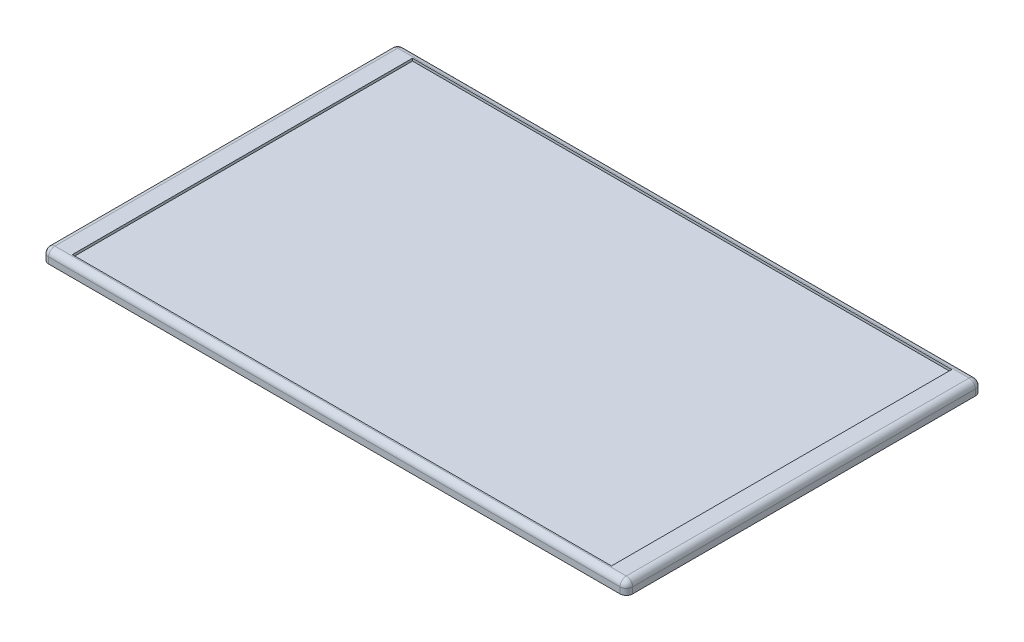
ISO-10303-21;
HEADER;
FILE_DESCRIPTION(('STEP AP214'),'2;1');
FILE_NAME('part.step','',(''),(''),'','','');
FILE_SCHEMA(('AUTOMOTIVE_DESIGN { 1 0 10303 214 1 1 1 1 }'));
ENDSEC;
DATA;
#1=APPLICATION_CONTEXT('core data for automotive mechanical design processes');
#2=APPLICATION_PROTOCOL_DEFINITION('international standard','automotive_design',2000,#1);
#3=PRODUCT_CONTEXT('',#1,'mechanical');
#4=PRODUCT('Part','Part','',(#3));
#5=PRODUCT_RELATED_PRODUCT_CATEGORY('part','',(#4));
#6=PRODUCT_DEFINITION_FORMATION('','',#4);
#7=PRODUCT_DEFINITION_CONTEXT('part definition',#1,'design');
#8=PRODUCT_DEFINITION('design','',#6,#7);
#9=PRODUCT_DEFINITION_SHAPE('','',#8);
#10=(LENGTH_UNIT() NAMED_UNIT(*) SI_UNIT(.MILLI.,.METRE.));
#11=(NAMED_UNIT(*) PLANE_ANGLE_UNIT() SI_UNIT($,.RADIAN.));
#12=(NAMED_UNIT(*) SI_UNIT($,.STERADIAN.) SOLID_ANGLE_UNIT());
#13=UNCERTAINTY_MEASURE_WITH_UNIT(LENGTH_MEASURE(1.E-05),#10,'distance_accuracy_value','');
#14=(GEOMETRIC_REPRESENTATION_CONTEXT(3) GLOBAL_UNCERTAINTY_ASSIGNED_CONTEXT((#13)) GLOBAL_UNIT_ASSIGNED_CONTEXT((#10,
#11,#12)) REPRESENTATION_CONTEXT('',''));
#15=CARTESIAN_POINT('',(0.,0.,0.));
#16=DIRECTION('',(0.,0.,1.));
#17=DIRECTION('',(1.,0.,0.));
#18=AXIS2_PLACEMENT_3D('',#15,#16,#17);
#19=CARTESIAN_POINT('',(0.,5.,0.));
#20=DIRECTION('',(1.,0.,0.));
#21=DIRECTION('',(0.,0.,-1.));
#22=AXIS2_PLACEMENT_3D('',#19,#20,#21);
#23=PLANE('',#22);
#24=DIRECTION('',(0.,0.,1.));
#25=VECTOR('',#24,1.);
#26=CARTESIAN_POINT('',(0.,2.46,0.));
#27=LINE('',#26,#25);
#28=CARTESIAN_POINT('',(0.,2.46,-2.54));
#29=VERTEX_POINT('',#28);
#30=CARTESIAN_POINT('',(0.,2.46,-140.46));
#31=VERTEX_POINT('',#30);
#32=EDGE_CURVE('E208',#29,#31,#27,.F.);
#33=ORIENTED_EDGE('',*,*,#32,.T.);
#34=DIRECTION('',(0.,-1.,0.));
#35=VECTOR('',#34,1.);
#36=CARTESIAN_POINT('',(0.,5.,-140.46));
#37=LINE('',#36,#35);
#38=CARTESIAN_POINT('',(0.,0.,-140.46));
#39=VERTEX_POINT('',#38);
#40=EDGE_CURVE('E212',#31,#39,#37,.T.);
#41=ORIENTED_EDGE('',*,*,#40,.T.);
#42=DIRECTION('',(0.,0.,1.));
#43=VECTOR('',#42,1.);
#44=CARTESIAN_POINT('',(0.,0.,0.));
#45=LINE('',#44,#43);
#46=CARTESIAN_POINT('',(0.,0.,-2.54));
#47=VERTEX_POINT('',#46);
#48=EDGE_CURVE('E172',#39,#47,#45,.T.);
#49=ORIENTED_EDGE('',*,*,#48,.T.);
#50=DIRECTION('',(0.,-1.,0.));
#51=VECTOR('',#50,1.);
#52=CARTESIAN_POINT('',(0.,5.,-2.54));
#53=LINE('',#52,#51);
#54=EDGE_CURVE('E210',#47,#29,#53,.F.);
#55=ORIENTED_EDGE('',*,*,#54,.T.);
#56=EDGE_LOOP('',(#33,#41,#49,#55));
#57=FACE_BOUND('',#56,.T.);
#58=ADVANCED_FACE('F32',(#57),#23,.F.);
#59=CARTESIAN_POINT('',(0.,5.,0.));
#60=DIRECTION('',(0.,0.,-1.));
#61=DIRECTION('',(-1.,0.,0.));
#62=AXIS2_PLACEMENT_3D('',#59,#60,#61);
#63=PLANE('',#62);
#64=DIRECTION('',(1.,0.,0.));
#65=VECTOR('',#64,1.);
#66=CARTESIAN_POINT('',(0.,2.46,0.));
#67=LINE('',#66,#65);
#68=CARTESIAN_POINT('',(232.46,2.46,0.));
#69=VERTEX_POINT('',#68);
#70=CARTESIAN_POINT('',(2.54,2.46,0.));
#71=VERTEX_POINT('',#70);
#72=EDGE_CURVE('E214',#69,#71,#67,.F.);
#73=ORIENTED_EDGE('',*,*,#72,.T.);
#74=DIRECTION('',(0.,-1.,0.));
#75=VECTOR('',#74,1.);
#76=CARTESIAN_POINT('',(2.54,5.,0.));
#77=LINE('',#76,#75);
#78=CARTESIAN_POINT('',(2.54,0.,0.));
#79=VERTEX_POINT('',#78);
#80=EDGE_CURVE('E218',#71,#79,#77,.T.);
#81=ORIENTED_EDGE('',*,*,#80,.T.);
#82=DIRECTION('',(1.,0.,0.));
#83=VECTOR('',#82,1.);
#84=CARTESIAN_POINT('',(0.,0.,0.));
#85=LINE('',#84,#83);
#86=CARTESIAN_POINT('',(232.46,0.,0.));
#87=VERTEX_POINT('',#86);
#88=EDGE_CURVE('E178',#79,#87,#85,.T.);
#89=ORIENTED_EDGE('',*,*,#88,.T.);
#90=DIRECTION('',(0.,-1.,0.));
#91=VECTOR('',#90,1.);
#92=CARTESIAN_POINT('',(232.46,5.,0.));
#93=LINE('',#92,#91);
#94=EDGE_CURVE('E216',#87,#69,#93,.F.);
#95=ORIENTED_EDGE('',*,*,#94,.T.);
#96=EDGE_LOOP('',(#73,#81,#89,#95));
#97=FACE_BOUND('',#96,.T.);
#98=ADVANCED_FACE('F271',(#97),#63,.F.);
#99=CARTESIAN_POINT('',(235.,5.,0.));
#100=DIRECTION('',(-1.,0.,0.));
#101=DIRECTION('',(0.,0.,1.));
#102=AXIS2_PLACEMENT_3D('',#99,#100,#101);
#103=PLANE('',#102);
#104=DIRECTION('',(0.,0.,-1.));
#105=VECTOR('',#104,1.);
#106=CARTESIAN_POINT('',(235.,0.,0.));
#107=LINE('',#106,#105);
#108=CARTESIAN_POINT('',(235.,0.,-2.54));
#109=VERTEX_POINT('',#108);
#110=CARTESIAN_POINT('',(235.,0.,-140.46));
#111=VERTEX_POINT('',#110);
#112=EDGE_CURVE('E181',#109,#111,#107,.T.);
#113=ORIENTED_EDGE('',*,*,#112,.T.);
#114=DIRECTION('',(0.,-1.,0.));
#115=VECTOR('',#114,1.);
#116=CARTESIAN_POINT('',(235.,5.,-140.46));
#117=LINE('',#116,#115);
#118=CARTESIAN_POINT('',(235.,2.46,-140.46));
#119=VERTEX_POINT('',#118);
#120=EDGE_CURVE('E206',#111,#119,#117,.F.);
#121=ORIENTED_EDGE('',*,*,#120,.T.);
#122=DIRECTION('',(0.,0.,-1.));
#123=VECTOR('',#122,1.);
#124=CARTESIAN_POINT('',(235.,2.46,0.));
#125=LINE('',#124,#123);
#126=CARTESIAN_POINT('',(235.,2.46,-2.54));
#127=VERTEX_POINT('',#126);
#128=EDGE_CURVE('E202',#119,#127,#125,.F.);
#129=ORIENTED_EDGE('',*,*,#128,.T.);
#130=DIRECTION('',(0.,-1.,0.));
#131=VECTOR('',#130,1.);
#132=CARTESIAN_POINT('',(235.,5.,-2.54));
#133=LINE('',#132,#131);
#134=EDGE_CURVE('E204',#127,#109,#133,.T.);
#135=ORIENTED_EDGE('',*,*,#134,.T.);
#136=EDGE_LOOP('',(#113,#121,#129,#135));
#137=FACE_BOUND('',#136,.T.);
#138=ADVANCED_FACE('F310',(#137),#103,.F.);
#139=CARTESIAN_POINT('',(0.,5.,-143.));
#140=DIRECTION('',(0.,0.,1.));
#141=DIRECTION('',(1.,0.,0.));
#142=AXIS2_PLACEMENT_3D('',#139,#140,#141);
#143=PLANE('',#142);
#144=DIRECTION('',(-1.,0.,0.));
#145=VECTOR('',#144,1.);
#146=CARTESIAN_POINT('',(0.,2.46,-143.));
#147=LINE('',#146,#145);
#148=CARTESIAN_POINT('',(2.54,2.46,-143.));
#149=VERTEX_POINT('',#148);
#150=CARTESIAN_POINT('',(232.46,2.46,-143.));
#151=VERTEX_POINT('',#150);
#152=EDGE_CURVE('E187',#149,#151,#147,.F.);
#153=ORIENTED_EDGE('',*,*,#152,.T.);
#154=DIRECTION('',(0.,-1.,0.));
#155=VECTOR('',#154,1.);
#156=CARTESIAN_POINT('',(232.46,5.,-143.));
#157=LINE('',#156,#155);
#158=CARTESIAN_POINT('',(232.46,0.,-143.));
#159=VERTEX_POINT('',#158);
#160=EDGE_CURVE('E191',#151,#159,#157,.T.);
#161=ORIENTED_EDGE('',*,*,#160,.T.);
#162=DIRECTION('',(-1.,0.,0.));
#163=VECTOR('',#162,1.);
#164=CARTESIAN_POINT('',(0.,0.,-143.));
#165=LINE('',#164,#163);
#166=CARTESIAN_POINT('',(2.54,0.,-143.));
#167=VERTEX_POINT('',#166);
#168=EDGE_CURVE('E184',#159,#167,#165,.T.);
#169=ORIENTED_EDGE('',*,*,#168,.T.);
#170=DIRECTION('',(0.,-1.,0.));
#171=VECTOR('',#170,1.);
#172=CARTESIAN_POINT('',(2.54,5.,-143.));
#173=LINE('',#172,#171);
#174=EDGE_CURVE('E189',#167,#149,#173,.F.);
#175=ORIENTED_EDGE('',*,*,#174,.T.);
#176=EDGE_LOOP('',(#153,#161,#169,#175));
#177=FACE_BOUND('',#176,.T.);
#178=ADVANCED_FACE('F301',(#177),#143,.F.);
#179=CARTESIAN_POINT('',(0.,5.,0.));
#180=DIRECTION('',(0.,-1.,0.));
#181=DIRECTION('',(0.,0.,-1.));
#182=AXIS2_PLACEMENT_3D('',#179,#180,#181);
#183=PLANE('',#182);
#184=DIRECTION('',(0.,0.,1.));
#185=VECTOR('',#184,1.);
#186=CARTESIAN_POINT('',(2.54,5.,0.));
#187=LINE('',#186,#185);
#188=CARTESIAN_POINT('',(2.54,5.,-140.46));
#189=VERTEX_POINT('',#188);
#190=CARTESIAN_POINT('',(2.54,5.,-2.54));
#191=VERTEX_POINT('',#190);
#192=EDGE_CURVE('E220',#189,#191,#187,.T.);
#193=ORIENTED_EDGE('',*,*,#192,.T.);
#194=DIRECTION('',(1.,0.,0.));
#195=VECTOR('',#194,1.);
#196=CARTESIAN_POINT('',(0.,5.,-2.54));
#197=LINE('',#196,#195);
#198=CARTESIAN_POINT('',(232.46,5.,-2.54));
#199=VERTEX_POINT('',#198);
#200=EDGE_CURVE('E11',#191,#199,#197,.T.);
#201=ORIENTED_EDGE('',*,*,#200,.T.);
#202=DIRECTION('',(0.,0.,-1.));
#203=VECTOR('',#202,1.);
#204=CARTESIAN_POINT('',(232.46,5.,0.));
#205=LINE('',#204,#203);
#206=CARTESIAN_POINT('',(232.46,5.,-140.46));
#207=VERTEX_POINT('',#206);
#208=EDGE_CURVE('E41',#199,#207,#205,.T.);
#209=ORIENTED_EDGE('',*,*,#208,.T.);
#210=DIRECTION('',(-1.,0.,0.));
#211=VECTOR('',#210,1.);
#212=CARTESIAN_POINT('',(0.,5.,-140.46));
#213=LINE('',#212,#211);
#214=EDGE_CURVE('E222',#207,#189,#213,.T.);
#215=ORIENTED_EDGE('',*,*,#214,.T.);
#216=EDGE_LOOP('',(#193,#201,#209,#215));
#217=FACE_BOUND('',#216,.T.);
#218=DIRECTION('',(1.,0.,0.));
#219=VECTOR('',#218,1.);
#220=CARTESIAN_POINT('',(9.02,5.,-3.05087655784032));
#221=LINE('',#220,#219);
#222=CARTESIAN_POINT('',(9.02,5.,-3.05087655784032));
#223=VERTEX_POINT('',#222);
#224=CARTESIAN_POINT('',(225.98,5.,-3.05087655784033));
#225=VERTEX_POINT('',#224);
#226=EDGE_CURVE('E166',#223,#225,#221,.T.);
#227=ORIENTED_EDGE('',*,*,#226,.F.);
#228=DIRECTION('',(0.,0.,1.));
#229=VECTOR('',#228,1.);
#230=CARTESIAN_POINT('',(9.02,5.,-3.05087655784032));
#231=LINE('',#230,#229);
#232=CARTESIAN_POINT('',(9.01999999999999,5.,-139.949123442159));
#233=VERTEX_POINT('',#232);
#234=EDGE_CURVE('E140',#233,#223,#231,.T.);
#235=ORIENTED_EDGE('',*,*,#234,.F.);
#236=DIRECTION('',(-1.,0.,0.));
#237=VECTOR('',#236,1.);
#238=CARTESIAN_POINT('',(9.01999999999999,5.,-139.949123442159));
#239=LINE('',#238,#237);
#240=CARTESIAN_POINT('',(225.98,5.,-139.94912344216));
#241=VERTEX_POINT('',#240);
#242=EDGE_CURVE('E157',#241,#233,#239,.T.);
#243=ORIENTED_EDGE('',*,*,#242,.F.);
#244=DIRECTION('',(0.,0.,-1.));
#245=VECTOR('',#244,1.);
#246=CARTESIAN_POINT('',(225.98,5.,-3.05087655784033));
#247=LINE('',#246,#245);
#248=EDGE_CURVE('E160',#225,#241,#247,.T.);
#249=ORIENTED_EDGE('',*,*,#248,.F.);
#250=EDGE_LOOP('',(#227,#235,#243,#249));
#251=FACE_BOUND('',#250,.T.);
#252=ADVANCED_FACE('F286',(#217,#251),#183,.F.);
#253=CARTESIAN_POINT('',(0.,0.,0.));
#254=DIRECTION('',(0.,-1.,0.));
#255=DIRECTION('',(0.,0.,-1.));
#256=AXIS2_PLACEMENT_3D('',#253,#254,#255);
#257=PLANE('',#256);
#258=ORIENTED_EDGE('',*,*,#168,.F.);
#259=CARTESIAN_POINT('',(232.46,0.,-140.46));
#260=DIRECTION('',(0.,-1.,0.));
#261=DIRECTION('',(0.,0.,-1.));
#262=AXIS2_PLACEMENT_3D('',#259,#260,#261);
#263=CIRCLE('',#262,2.54);
#264=EDGE_CURVE('E200',#159,#111,#263,.T.);
#265=ORIENTED_EDGE('',*,*,#264,.T.);
#266=ORIENTED_EDGE('',*,*,#112,.F.);
#267=CARTESIAN_POINT('',(232.46,0.,-2.54));
#268=DIRECTION('',(0.,-1.,0.));
#269=DIRECTION('',(0.,0.,-1.));
#270=AXIS2_PLACEMENT_3D('',#267,#268,#269);
#271=CIRCLE('',#270,2.54);
#272=EDGE_CURVE('E194',#109,#87,#271,.T.);
#273=ORIENTED_EDGE('',*,*,#272,.T.);
#274=ORIENTED_EDGE('',*,*,#88,.F.);
#275=CARTESIAN_POINT('',(2.54,0.,-2.54));
#276=DIRECTION('',(0.,-1.,0.));
#277=DIRECTION('',(0.,0.,-1.));
#278=AXIS2_PLACEMENT_3D('',#275,#276,#277);
#279=CIRCLE('',#278,2.54);
#280=EDGE_CURVE('E196',#79,#47,#279,.T.);
#281=ORIENTED_EDGE('',*,*,#280,.T.);
#282=ORIENTED_EDGE('',*,*,#48,.F.);
#283=CARTESIAN_POINT('',(2.54,0.,-140.46));
#284=DIRECTION('',(0.,-1.,0.));
#285=DIRECTION('',(0.,0.,-1.));
#286=AXIS2_PLACEMENT_3D('',#283,#284,#285);
#287=CIRCLE('',#286,2.54);
#288=EDGE_CURVE('E198',#39,#167,#287,.T.);
#289=ORIENTED_EDGE('',*,*,#288,.T.);
#290=EDGE_LOOP('',(#258,#265,#266,#273,#274,#281,#282,#289));
#291=FACE_BOUND('',#290,.T.);
#292=ADVANCED_FACE('F275',(#291),#257,.T.);
#293=CARTESIAN_POINT('',(9.02,4.,-3.05087655784032));
#294=DIRECTION('',(-1.,0.,0.));
#295=DIRECTION('',(0.,0.,1.));
#296=AXIS2_PLACEMENT_3D('',#293,#294,#295);
#297=PLANE('',#296);
#298=ORIENTED_EDGE('',*,*,#234,.T.);
#299=DIRECTION('',(0.,1.,0.));
#300=VECTOR('',#299,1.);
#301=CARTESIAN_POINT('',(9.02,4.,-3.05087655784032));
#302=LINE('',#301,#300);
#303=CARTESIAN_POINT('',(9.02,4.,-3.05087655784032));
#304=VERTEX_POINT('',#303);
#305=EDGE_CURVE('E133',#304,#223,#302,.T.);
#306=ORIENTED_EDGE('',*,*,#305,.F.);
#307=DIRECTION('',(0.,0.,1.));
#308=VECTOR('',#307,1.);
#309=CARTESIAN_POINT('',(9.02,4.,-3.05087655784032));
#310=LINE('',#309,#308);
#311=CARTESIAN_POINT('',(9.01999999999999,4.,-139.949123442159));
#312=VERTEX_POINT('',#311);
#313=EDGE_CURVE('E137',#312,#304,#310,.T.);
#314=ORIENTED_EDGE('',*,*,#313,.F.);
#315=DIRECTION('',(0.,1.,0.));
#316=VECTOR('',#315,1.);
#317=CARTESIAN_POINT('',(9.01999999999999,4.,-139.949123442159));
#318=LINE('',#317,#316);
#319=EDGE_CURVE('E170',#312,#233,#318,.T.);
#320=ORIENTED_EDGE('',*,*,#319,.T.);
#321=EDGE_LOOP('',(#298,#306,#314,#320));
#322=FACE_BOUND('',#321,.T.);
#323=ADVANCED_FACE('F135',(#322),#297,.F.);
#324=CARTESIAN_POINT('',(9.01999999999999,4.,-139.949123442159));
#325=DIRECTION('',(0.,0.,-1.));
#326=DIRECTION('',(-1.,0.,0.));
#327=AXIS2_PLACEMENT_3D('',#324,#325,#326);
#328=PLANE('',#327);
#329=ORIENTED_EDGE('',*,*,#242,.T.);
#330=ORIENTED_EDGE('',*,*,#319,.F.);
#331=DIRECTION('',(-1.,0.,0.));
#332=VECTOR('',#331,1.);
#333=CARTESIAN_POINT('',(9.01999999999999,4.,-139.949123442159));
#334=LINE('',#333,#332);
#335=CARTESIAN_POINT('',(225.98,4.,-139.94912344216));
#336=VERTEX_POINT('',#335);
#337=EDGE_CURVE('E145',#336,#312,#334,.T.);
#338=ORIENTED_EDGE('',*,*,#337,.F.);
#339=DIRECTION('',(0.,1.,0.));
#340=VECTOR('',#339,1.);
#341=CARTESIAN_POINT('',(225.98,4.,-139.94912344216));
#342=LINE('',#341,#340);
#343=EDGE_CURVE('E173',#336,#241,#342,.T.);
#344=ORIENTED_EDGE('',*,*,#343,.T.);
#345=EDGE_LOOP('',(#329,#330,#338,#344));
#346=FACE_BOUND('',#345,.T.);
#347=ADVANCED_FACE('F436',(#346),#328,.F.);
#348=CARTESIAN_POINT('',(225.98,4.,-3.05087655784033));
#349=DIRECTION('',(1.,0.,0.));
#350=DIRECTION('',(0.,0.,-1.));
#351=AXIS2_PLACEMENT_3D('',#348,#349,#350);
#352=PLANE('',#351);
#353=ORIENTED_EDGE('',*,*,#248,.T.);
#354=ORIENTED_EDGE('',*,*,#343,.F.);
#355=DIRECTION('',(0.,0.,-1.));
#356=VECTOR('',#355,1.);
#357=CARTESIAN_POINT('',(225.98,4.,-3.05087655784033));
#358=LINE('',#357,#356);
#359=CARTESIAN_POINT('',(225.98,4.,-3.05087655784033));
#360=VERTEX_POINT('',#359);
#361=EDGE_CURVE('E153',#360,#336,#358,.T.);
#362=ORIENTED_EDGE('',*,*,#361,.F.);
#363=DIRECTION('',(0.,1.,0.));
#364=VECTOR('',#363,1.);
#365=CARTESIAN_POINT('',(225.98,4.,-3.05087655784033));
#366=LINE('',#365,#364);
#367=EDGE_CURVE('E144',#360,#225,#366,.T.);
#368=ORIENTED_EDGE('',*,*,#367,.T.);
#369=EDGE_LOOP('',(#353,#354,#362,#368));
#370=FACE_BOUND('',#369,.T.);
#371=ADVANCED_FACE('F428',(#370),#352,.F.);
#372=CARTESIAN_POINT('',(9.02,4.,-3.05087655784032));
#373=DIRECTION('',(0.,0.,1.));
#374=DIRECTION('',(1.,0.,0.));
#375=AXIS2_PLACEMENT_3D('',#372,#373,#374);
#376=PLANE('',#375);
#377=ORIENTED_EDGE('',*,*,#226,.T.);
#378=ORIENTED_EDGE('',*,*,#367,.F.);
#379=DIRECTION('',(1.,0.,0.));
#380=VECTOR('',#379,1.);
#381=CARTESIAN_POINT('',(9.02,4.,-3.05087655784032));
#382=LINE('',#381,#380);
#383=EDGE_CURVE('E148',#304,#360,#382,.T.);
#384=ORIENTED_EDGE('',*,*,#383,.F.);
#385=ORIENTED_EDGE('',*,*,#305,.T.);
#386=EDGE_LOOP('',(#377,#378,#384,#385));
#387=FACE_BOUND('',#386,.T.);
#388=ADVANCED_FACE('F149',(#387),#376,.F.);
#389=CARTESIAN_POINT('',(0.,4.,0.));
#390=DIRECTION('',(0.,-1.,0.));
#391=DIRECTION('',(0.,0.,-1.));
#392=AXIS2_PLACEMENT_3D('',#389,#390,#391);
#393=PLANE('',#392);
#394=ORIENTED_EDGE('',*,*,#313,.T.);
#395=ORIENTED_EDGE('',*,*,#383,.T.);
#396=ORIENTED_EDGE('',*,*,#361,.T.);
#397=ORIENTED_EDGE('',*,*,#337,.T.);
#398=EDGE_LOOP('',(#394,#395,#396,#397));
#399=FACE_BOUND('',#398,.T.);
#400=ADVANCED_FACE('F155',(#399),#393,.F.);
#401=CARTESIAN_POINT('',(2.54,5.,-2.54));
#402=DIRECTION('',(0.,-1.,0.));
#403=DIRECTION('',(0.,0.,-1.));
#404=AXIS2_PLACEMENT_3D('',#401,#402,#403);
#405=CYLINDRICAL_SURFACE('',#404,2.54);
#406=CARTESIAN_POINT('',(2.54,2.46,-2.54));
#407=DIRECTION('',(0.,1.,0.));
#408=DIRECTION('',(0.,0.,1.));
#409=AXIS2_PLACEMENT_3D('',#406,#407,#408);
#410=CIRCLE('',#409,2.54);
#411=EDGE_CURVE('E36',#29,#71,#410,.T.);
#412=ORIENTED_EDGE('',*,*,#411,.F.);
#413=ORIENTED_EDGE('',*,*,#54,.F.);
#414=ORIENTED_EDGE('',*,*,#280,.F.);
#415=ORIENTED_EDGE('',*,*,#80,.F.);
#416=EDGE_LOOP('',(#412,#413,#414,#415));
#417=FACE_BOUND('',#416,.T.);
#418=ADVANCED_FACE('F34',(#417),#405,.T.);
#419=CARTESIAN_POINT('',(2.54,2.46,-2.54));
#420=DIRECTION('',(0.,0.,1.));
#421=DIRECTION('',(1.,0.,0.));
#422=AXIS2_PLACEMENT_3D('',#419,#420,#421);
#423=SPHERICAL_SURFACE('',#422,2.54);
#424=CARTESIAN_POINT('',(2.54,2.46,-2.54));
#425=DIRECTION('',(0.,0.,1.));
#426=DIRECTION('',(1.,0.,0.));
#427=AXIS2_PLACEMENT_3D('',#424,#425,#426);
#428=CIRCLE('',#427,2.54);
#429=EDGE_CURVE('E251',#29,#191,#428,.F.);
#430=ORIENTED_EDGE('',*,*,#429,.F.);
#431=ORIENTED_EDGE('',*,*,#411,.T.);
#432=CARTESIAN_POINT('',(2.54,2.46,-2.54));
#433=DIRECTION('',(-1.,0.,0.));
#434=DIRECTION('',(0.,0.,1.));
#435=AXIS2_PLACEMENT_3D('',#432,#433,#434);
#436=CIRCLE('',#435,2.54);
#437=EDGE_CURVE('E253',#191,#71,#436,.F.);
#438=ORIENTED_EDGE('',*,*,#437,.F.);
#439=EDGE_LOOP('',(#430,#431,#438));
#440=FACE_BOUND('',#439,.T.);
#441=ADVANCED_FACE('F263',(#440),#423,.T.);
#442=CARTESIAN_POINT('',(232.46,5.,-2.54));
#443=DIRECTION('',(0.,-1.,0.));
#444=DIRECTION('',(0.,0.,-1.));
#445=AXIS2_PLACEMENT_3D('',#442,#443,#444);
#446=CYLINDRICAL_SURFACE('',#445,2.54);
#447=ORIENTED_EDGE('',*,*,#272,.F.);
#448=ORIENTED_EDGE('',*,*,#134,.F.);
#449=CARTESIAN_POINT('',(232.46,2.46,-2.54));
#450=DIRECTION('',(0.,1.,0.));
#451=DIRECTION('',(0.,0.,1.));
#452=AXIS2_PLACEMENT_3D('',#449,#450,#451);
#453=CIRCLE('',#452,2.54);
#454=EDGE_CURVE('E248',#69,#127,#453,.T.);
#455=ORIENTED_EDGE('',*,*,#454,.F.);
#456=ORIENTED_EDGE('',*,*,#94,.F.);
#457=EDGE_LOOP('',(#447,#448,#455,#456));
#458=FACE_BOUND('',#457,.T.);
#459=ADVANCED_FACE('F281',(#458),#446,.T.);
#460=CARTESIAN_POINT('',(0.,2.46,-2.54));
#461=DIRECTION('',(1.,0.,0.));
#462=DIRECTION('',(0.,0.,-1.));
#463=AXIS2_PLACEMENT_3D('',#460,#461,#462);
#464=CYLINDRICAL_SURFACE('',#463,2.54);
#465=ORIENTED_EDGE('',*,*,#437,.T.);
#466=ORIENTED_EDGE('',*,*,#72,.F.);
#467=CARTESIAN_POINT('',(232.46,2.46,-2.54));
#468=DIRECTION('',(1.,0.,0.));
#469=DIRECTION('',(0.,0.,-1.));
#470=AXIS2_PLACEMENT_3D('',#467,#468,#469);
#471=CIRCLE('',#470,2.54);
#472=EDGE_CURVE('E245',#199,#69,#471,.T.);
#473=ORIENTED_EDGE('',*,*,#472,.F.);
#474=ORIENTED_EDGE('',*,*,#200,.F.);
#475=EDGE_LOOP('',(#465,#466,#473,#474));
#476=FACE_BOUND('',#475,.T.);
#477=ADVANCED_FACE('F284',(#476),#464,.T.);
#478=CARTESIAN_POINT('',(2.54,2.46,0.));
#479=DIRECTION('',(0.,0.,1.));
#480=DIRECTION('',(1.,0.,0.));
#481=AXIS2_PLACEMENT_3D('',#478,#479,#480);
#482=CYLINDRICAL_SURFACE('',#481,2.54);
#483=ORIENTED_EDGE('',*,*,#429,.T.);
#484=ORIENTED_EDGE('',*,*,#192,.F.);
#485=CARTESIAN_POINT('',(2.54,2.46,-140.46));
#486=DIRECTION('',(0.,0.,-1.));
#487=DIRECTION('',(-1.,0.,0.));
#488=AXIS2_PLACEMENT_3D('',#485,#486,#487);
#489=CIRCLE('',#488,2.54);
#490=EDGE_CURVE('E242',#31,#189,#489,.T.);
#491=ORIENTED_EDGE('',*,*,#490,.F.);
#492=ORIENTED_EDGE('',*,*,#32,.F.);
#493=EDGE_LOOP('',(#483,#484,#491,#492));
#494=FACE_BOUND('',#493,.T.);
#495=ADVANCED_FACE('F291',(#494),#482,.T.);
#496=CARTESIAN_POINT('',(2.54,5.,-140.46));
#497=DIRECTION('',(0.,-1.,0.));
#498=DIRECTION('',(0.,0.,-1.));
#499=AXIS2_PLACEMENT_3D('',#496,#497,#498);
#500=CYLINDRICAL_SURFACE('',#499,2.54);
#501=ORIENTED_EDGE('',*,*,#288,.F.);
#502=ORIENTED_EDGE('',*,*,#40,.F.);
#503=CARTESIAN_POINT('',(2.54,2.46,-140.46));
#504=DIRECTION('',(0.,1.,0.));
#505=DIRECTION('',(0.,0.,1.));
#506=AXIS2_PLACEMENT_3D('',#503,#504,#505);
#507=CIRCLE('',#506,2.54);
#508=EDGE_CURVE('E239',#149,#31,#507,.T.);
#509=ORIENTED_EDGE('',*,*,#508,.F.);
#510=ORIENTED_EDGE('',*,*,#174,.F.);
#511=EDGE_LOOP('',(#501,#502,#509,#510));
#512=FACE_BOUND('',#511,.T.);
#513=ADVANCED_FACE('F297',(#512),#500,.T.);
#514=CARTESIAN_POINT('',(232.46,2.46,-2.54));
#515=DIRECTION('',(0.,0.,1.));
#516=DIRECTION('',(1.,0.,0.));
#517=AXIS2_PLACEMENT_3D('',#514,#515,#516);
#518=SPHERICAL_SURFACE('',#517,2.54);
#519=ORIENTED_EDGE('',*,*,#472,.T.);
#520=ORIENTED_EDGE('',*,*,#454,.T.);
#521=CARTESIAN_POINT('',(232.46,2.46,-2.54));
#522=DIRECTION('',(0.,0.,1.));
#523=DIRECTION('',(1.,0.,0.));
#524=AXIS2_PLACEMENT_3D('',#521,#522,#523);
#525=CIRCLE('',#524,2.54);
#526=EDGE_CURVE('E237',#199,#127,#525,.F.);
#527=ORIENTED_EDGE('',*,*,#526,.F.);
#528=EDGE_LOOP('',(#519,#520,#527));
#529=FACE_BOUND('',#528,.T.);
#530=ADVANCED_FACE('F320',(#529),#518,.T.);
#531=CARTESIAN_POINT('',(2.54,2.46,-140.46));
#532=DIRECTION('',(0.,0.,1.));
#533=DIRECTION('',(1.,0.,0.));
#534=AXIS2_PLACEMENT_3D('',#531,#532,#533);
#535=SPHERICAL_SURFACE('',#534,2.54);
#536=ORIENTED_EDGE('',*,*,#508,.T.);
#537=ORIENTED_EDGE('',*,*,#490,.T.);
#538=CARTESIAN_POINT('',(2.54,2.46,-140.46));
#539=DIRECTION('',(-1.,0.,0.));
#540=DIRECTION('',(0.,0.,1.));
#541=AXIS2_PLACEMENT_3D('',#538,#539,#540);
#542=CIRCLE('',#541,2.54);
#543=EDGE_CURVE('E234',#149,#189,#542,.F.);
#544=ORIENTED_EDGE('',*,*,#543,.F.);
#545=EDGE_LOOP('',(#536,#537,#544));
#546=FACE_BOUND('',#545,.T.);
#547=ADVANCED_FACE('F318',(#546),#535,.T.);
#548=CARTESIAN_POINT('',(232.46,2.46,0.));
#549=DIRECTION('',(0.,0.,-1.));
#550=DIRECTION('',(-1.,0.,0.));
#551=AXIS2_PLACEMENT_3D('',#548,#549,#550);
#552=CYLINDRICAL_SURFACE('',#551,2.54);
#553=ORIENTED_EDGE('',*,*,#526,.T.);
#554=ORIENTED_EDGE('',*,*,#128,.F.);
#555=CARTESIAN_POINT('',(232.46,2.46,-140.46));
#556=DIRECTION('',(0.,0.,-1.));
#557=DIRECTION('',(-1.,0.,0.));
#558=AXIS2_PLACEMENT_3D('',#555,#556,#557);
#559=CIRCLE('',#558,2.54);
#560=EDGE_CURVE('E231',#207,#119,#559,.T.);
#561=ORIENTED_EDGE('',*,*,#560,.F.);
#562=ORIENTED_EDGE('',*,*,#208,.F.);
#563=EDGE_LOOP('',(#553,#554,#561,#562));
#564=FACE_BOUND('',#563,.T.);
#565=ADVANCED_FACE('F312',(#564),#552,.T.);
#566=CARTESIAN_POINT('',(0.,2.46,-140.46));
#567=DIRECTION('',(-1.,0.,0.));
#568=DIRECTION('',(0.,0.,1.));
#569=AXIS2_PLACEMENT_3D('',#566,#567,#568);
#570=CYLINDRICAL_SURFACE('',#569,2.54);
#571=ORIENTED_EDGE('',*,*,#543,.T.);
#572=ORIENTED_EDGE('',*,*,#214,.F.);
#573=CARTESIAN_POINT('',(232.46,2.46,-140.46));
#574=DIRECTION('',(1.,0.,0.));
#575=DIRECTION('',(0.,0.,-1.));
#576=AXIS2_PLACEMENT_3D('',#573,#574,#575);
#577=CIRCLE('',#576,2.54);
#578=EDGE_CURVE('E228',#151,#207,#577,.T.);
#579=ORIENTED_EDGE('',*,*,#578,.F.);
#580=ORIENTED_EDGE('',*,*,#152,.F.);
#581=EDGE_LOOP('',(#571,#572,#579,#580));
#582=FACE_BOUND('',#581,.T.);
#583=ADVANCED_FACE('F316',(#582),#570,.T.);
#584=CARTESIAN_POINT('',(232.46,2.46,-140.46));
#585=DIRECTION('',(0.,0.,1.));
#586=DIRECTION('',(1.,0.,0.));
#587=AXIS2_PLACEMENT_3D('',#584,#585,#586);
#588=SPHERICAL_SURFACE('',#587,2.54);
#589=ORIENTED_EDGE('',*,*,#578,.T.);
#590=ORIENTED_EDGE('',*,*,#560,.T.);
#591=CARTESIAN_POINT('',(232.46,2.46,-140.46));
#592=DIRECTION('',(0.,1.,0.));
#593=DIRECTION('',(0.,0.,1.));
#594=AXIS2_PLACEMENT_3D('',#591,#592,#593);
#595=CIRCLE('',#594,2.54);
#596=EDGE_CURVE('E225',#151,#119,#595,.F.);
#597=ORIENTED_EDGE('',*,*,#596,.F.);
#598=EDGE_LOOP('',(#589,#590,#597));
#599=FACE_BOUND('',#598,.T.);
#600=ADVANCED_FACE('F314',(#599),#588,.T.);
#601=CARTESIAN_POINT('',(232.46,5.,-140.46));
#602=DIRECTION('',(0.,-1.,0.));
#603=DIRECTION('',(0.,0.,-1.));
#604=AXIS2_PLACEMENT_3D('',#601,#602,#603);
#605=CYLINDRICAL_SURFACE('',#604,2.54);
#606=ORIENTED_EDGE('',*,*,#596,.T.);
#607=ORIENTED_EDGE('',*,*,#120,.F.);
#608=ORIENTED_EDGE('',*,*,#264,.F.);
#609=ORIENTED_EDGE('',*,*,#160,.F.);
#610=EDGE_LOOP('',(#606,#607,#608,#609));
#611=FACE_BOUND('',#610,.T.);
#612=ADVANCED_FACE('F306',(#611),#605,.T.);
#613=CLOSED_SHELL('',(#58,#98,#138,#178,#252,#292,#323,#347,#371,#388,#400,#418,#441,#459,#477,
#495,#513,#530,#547,#565,#583,#600,#612));
#614=MANIFOLD_SOLID_BREP('B2',#613);
#615=ADVANCED_BREP_SHAPE_REPRESENTATION('',(#18,#614),#14);
#616=SHAPE_DEFINITION_REPRESENTATION(#9,#615);
ENDSEC;
END-ISO-10303-21;
